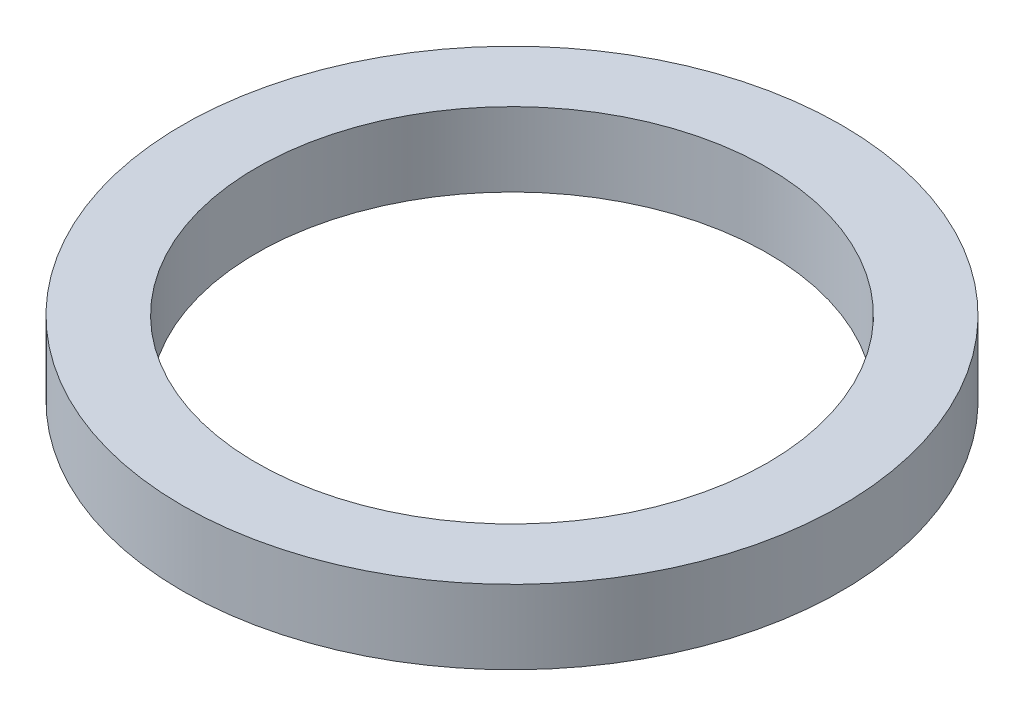
ISO-10303-21;
HEADER;
FILE_DESCRIPTION(('STEP AP214'),'2;1');
FILE_NAME('part.step','',(''),(''),'','','');
FILE_SCHEMA(('AUTOMOTIVE_DESIGN { 1 0 10303 214 1 1 1 1 }'));
ENDSEC;
DATA;
#1=APPLICATION_CONTEXT('core data for automotive mechanical design processes');
#2=APPLICATION_PROTOCOL_DEFINITION('international standard','automotive_design',2000,#1);
#3=PRODUCT_CONTEXT('',#1,'mechanical');
#4=PRODUCT('Part','Part','',(#3));
#5=PRODUCT_RELATED_PRODUCT_CATEGORY('part','',(#4));
#6=PRODUCT_DEFINITION_FORMATION('','',#4);
#7=PRODUCT_DEFINITION_CONTEXT('part definition',#1,'design');
#8=PRODUCT_DEFINITION('design','',#6,#7);
#9=PRODUCT_DEFINITION_SHAPE('','',#8);
#10=(LENGTH_UNIT() NAMED_UNIT(*) SI_UNIT(.MILLI.,.METRE.));
#11=(NAMED_UNIT(*) PLANE_ANGLE_UNIT() SI_UNIT($,.RADIAN.));
#12=(NAMED_UNIT(*) SI_UNIT($,.STERADIAN.) SOLID_ANGLE_UNIT());
#13=UNCERTAINTY_MEASURE_WITH_UNIT(LENGTH_MEASURE(1.E-05),#10,'distance_accuracy_value','');
#14=(GEOMETRIC_REPRESENTATION_CONTEXT(3) GLOBAL_UNCERTAINTY_ASSIGNED_CONTEXT((#13)) GLOBAL_UNIT_ASSIGNED_CONTEXT((#10,
#11,#12)) REPRESENTATION_CONTEXT('',''));
#15=CARTESIAN_POINT('',(0.,0.,0.));
#16=DIRECTION('',(0.,0.,1.));
#17=DIRECTION('',(1.,0.,0.));
#18=AXIS2_PLACEMENT_3D('',#15,#16,#17);
#19=CARTESIAN_POINT('',(0.,15.01648,0.));
#20=DIRECTION('',(0.,1.,0.));
#21=DIRECTION('',(0.,0.,1.));
#22=AXIS2_PLACEMENT_3D('',#19,#20,#21);
#23=PLANE('',#22);
#24=CARTESIAN_POINT('',(0.,15.01648,0.));
#25=DIRECTION('',(0.,1.,0.));
#26=DIRECTION('',(0.,0.,1.));
#27=AXIS2_PLACEMENT_3D('',#24,#25,#26);
#28=CIRCLE('',#27,66.908045);
#29=CARTESIAN_POINT('',(0.,15.01648,66.908045));
#30=VERTEX_POINT('',#29);
#31=EDGE_CURVE('E11',#30,#30,#28,.T.);
#32=ORIENTED_EDGE('',*,*,#31,.T.);
#33=EDGE_LOOP('',(#32));
#34=FACE_BOUND('',#33,.T.);
#35=CARTESIAN_POINT('',(0.,15.01648,0.));
#36=DIRECTION('',(0.,1.,0.));
#37=DIRECTION('',(1.,0.,0.));
#38=AXIS2_PLACEMENT_3D('',#35,#36,#37);
#39=CIRCLE('',#38,51.891565);
#40=CARTESIAN_POINT('',(51.891565,15.01648,0.));
#41=VERTEX_POINT('',#40);
#42=EDGE_CURVE('E45',#41,#41,#39,.T.);
#43=ORIENTED_EDGE('',*,*,#42,.F.);
#44=EDGE_LOOP('',(#43));
#45=FACE_BOUND('',#44,.T.);
#46=ADVANCED_FACE('F34',(#34,#45),#23,.T.);
#47=CARTESIAN_POINT('',(0.,0.,0.));
#48=DIRECTION('',(0.,1.,0.));
#49=DIRECTION('',(0.,0.,1.));
#50=AXIS2_PLACEMENT_3D('',#47,#48,#49);
#51=PLANE('',#50);
#52=CARTESIAN_POINT('',(0.,0.,0.));
#53=DIRECTION('',(0.,1.,0.));
#54=DIRECTION('',(0.,0.,1.));
#55=AXIS2_PLACEMENT_3D('',#52,#53,#54);
#56=CIRCLE('',#55,66.908045);
#57=CARTESIAN_POINT('',(0.,0.,66.908045));
#58=VERTEX_POINT('',#57);
#59=EDGE_CURVE('E38',#58,#58,#56,.T.);
#60=ORIENTED_EDGE('',*,*,#59,.F.);
#61=EDGE_LOOP('',(#60));
#62=FACE_BOUND('',#61,.T.);
#63=CARTESIAN_POINT('',(0.,0.,0.));
#64=DIRECTION('',(0.,1.,0.));
#65=DIRECTION('',(1.,0.,0.));
#66=AXIS2_PLACEMENT_3D('',#63,#64,#65);
#67=CIRCLE('',#66,51.891565);
#68=CARTESIAN_POINT('',(51.891565,0.,0.));
#69=VERTEX_POINT('',#68);
#70=EDGE_CURVE('E47',#69,#69,#67,.T.);
#71=ORIENTED_EDGE('',*,*,#70,.T.);
#72=EDGE_LOOP('',(#71));
#73=FACE_BOUND('',#72,.T.);
#74=ADVANCED_FACE('F57',(#62,#73),#51,.F.);
#75=CARTESIAN_POINT('',(0.,15.01648,0.));
#76=DIRECTION('',(0.,-1.,0.));
#77=DIRECTION('',(0.,0.,-1.));
#78=AXIS2_PLACEMENT_3D('',#75,#76,#77);
#79=CYLINDRICAL_SURFACE('',#78,66.908045);
#80=ORIENTED_EDGE('',*,*,#31,.F.);
#81=EDGE_LOOP('',(#80));
#82=FACE_BOUND('',#81,.T.);
#83=ORIENTED_EDGE('',*,*,#59,.T.);
#84=EDGE_LOOP('',(#83));
#85=FACE_BOUND('',#84,.T.);
#86=ADVANCED_FACE('F36',(#82,#85),#79,.T.);
#87=CARTESIAN_POINT('',(0.,15.01648,0.));
#88=DIRECTION('',(0.,-1.,0.));
#89=DIRECTION('',(0.,0.,-1.));
#90=AXIS2_PLACEMENT_3D('',#87,#88,#89);
#91=CYLINDRICAL_SURFACE('',#90,51.891565);
#92=ORIENTED_EDGE('',*,*,#42,.T.);
#93=EDGE_LOOP('',(#92));
#94=FACE_BOUND('',#93,.T.);
#95=ORIENTED_EDGE('',*,*,#70,.F.);
#96=EDGE_LOOP('',(#95));
#97=FACE_BOUND('',#96,.T.);
#98=ADVANCED_FACE('F53',(#94,#97),#91,.F.);
#99=CLOSED_SHELL('',(#46,#74,#86,#98));
#100=MANIFOLD_SOLID_BREP('B2',#99);
#101=ADVANCED_BREP_SHAPE_REPRESENTATION('',(#18,#100),#14);
#102=SHAPE_DEFINITION_REPRESENTATION(#9,#101);
ENDSEC;
END-ISO-10303-21;
